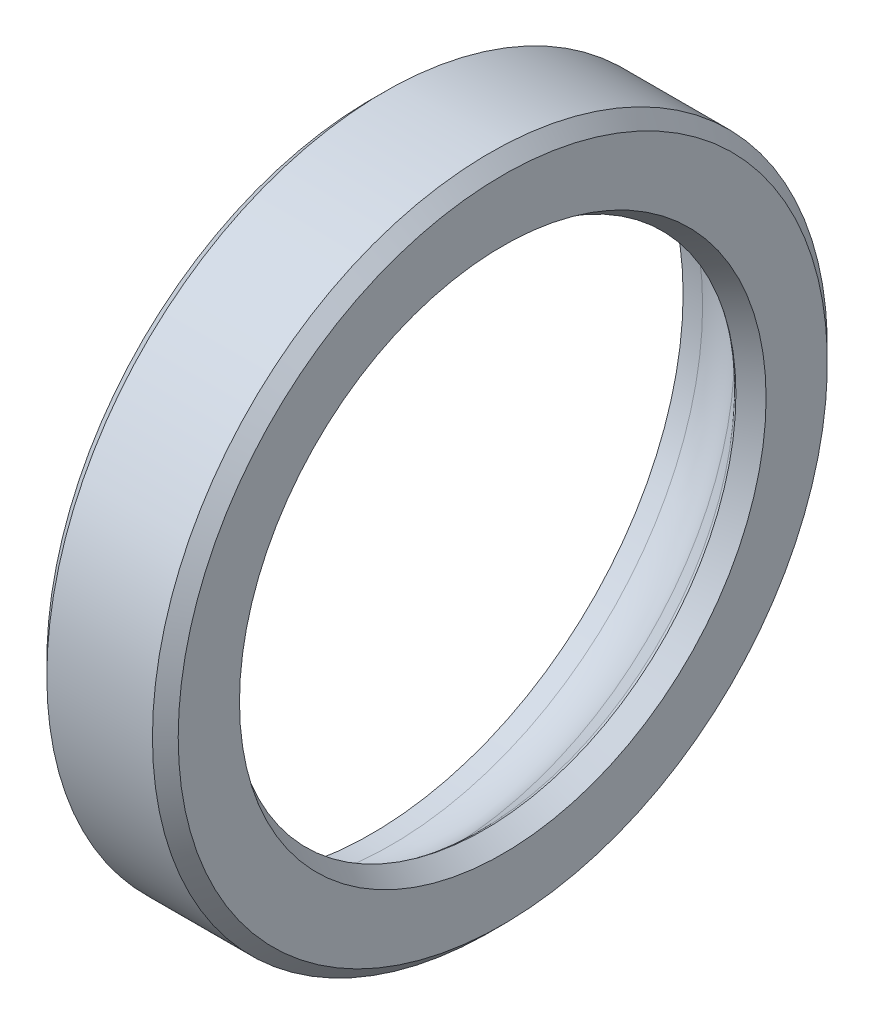
ISO-10303-21;
HEADER;
FILE_DESCRIPTION(('STEP AP214'),'2;1');
FILE_NAME('part.step','',(''),(''),'','','');
FILE_SCHEMA(('AUTOMOTIVE_DESIGN { 1 0 10303 214 1 1 1 1 }'));
ENDSEC;
DATA;
#1=APPLICATION_CONTEXT('core data for automotive mechanical design processes');
#2=APPLICATION_PROTOCOL_DEFINITION('international standard','automotive_design',2000,#1);
#3=PRODUCT_CONTEXT('',#1,'mechanical');
#4=PRODUCT('Part','Part','',(#3));
#5=PRODUCT_RELATED_PRODUCT_CATEGORY('part','',(#4));
#6=PRODUCT_DEFINITION_FORMATION('','',#4);
#7=PRODUCT_DEFINITION_CONTEXT('part definition',#1,'design');
#8=PRODUCT_DEFINITION('design','',#6,#7);
#9=PRODUCT_DEFINITION_SHAPE('','',#8);
#10=(LENGTH_UNIT() NAMED_UNIT(*) SI_UNIT(.MILLI.,.METRE.));
#11=(NAMED_UNIT(*) PLANE_ANGLE_UNIT() SI_UNIT($,.RADIAN.));
#12=(NAMED_UNIT(*) SI_UNIT($,.STERADIAN.) SOLID_ANGLE_UNIT());
#13=UNCERTAINTY_MEASURE_WITH_UNIT(LENGTH_MEASURE(1.E-05),#10,'distance_accuracy_value','');
#14=(GEOMETRIC_REPRESENTATION_CONTEXT(3) GLOBAL_UNCERTAINTY_ASSIGNED_CONTEXT((#13)) GLOBAL_UNIT_ASSIGNED_CONTEXT((#10,
#11,#12)) REPRESENTATION_CONTEXT('',''));
#15=CARTESIAN_POINT('',(0.,0.,0.));
#16=DIRECTION('',(0.,0.,1.));
#17=DIRECTION('',(1.,0.,0.));
#18=AXIS2_PLACEMENT_3D('',#15,#16,#17);
#19=CARTESIAN_POINT('',(0.,0.,0.));
#20=DIRECTION('',(-1.,0.,0.));
#21=DIRECTION('',(0.,0.,1.));
#22=AXIS2_PLACEMENT_3D('',#19,#20,#21);
#23=CYLINDRICAL_SURFACE('',#22,6.05);
#24=CARTESIAN_POINT('',(0.37867965644035,0.,0.));
#25=DIRECTION('',(-1.,0.,0.));
#26=DIRECTION('',(0.,0.,1.));
#27=AXIS2_PLACEMENT_3D('',#24,#25,#26);
#28=CIRCLE('',#27,6.05);
#29=CARTESIAN_POINT('',(0.37867965644035,0.,6.05));
#30=VERTEX_POINT('',#29);
#31=EDGE_CURVE('E75',#30,#30,#28,.T.);
#32=ORIENTED_EDGE('',*,*,#31,.F.);
#33=EDGE_LOOP('',(#32));
#34=FACE_BOUND('',#33,.T.);
#35=CARTESIAN_POINT('',(0.,0.,0.));
#36=DIRECTION('',(-1.,0.,0.));
#37=DIRECTION('',(0.,0.,1.));
#38=AXIS2_PLACEMENT_3D('',#35,#36,#37);
#39=CIRCLE('',#38,6.05);
#40=CARTESIAN_POINT('',(0.,0.,6.05));
#41=VERTEX_POINT('',#40);
#42=EDGE_CURVE('E66',#41,#41,#39,.T.);
#43=ORIENTED_EDGE('',*,*,#42,.T.);
#44=EDGE_LOOP('',(#43));
#45=FACE_BOUND('',#44,.T.);
#46=ADVANCED_FACE('F39',(#34,#45),#23,.F.);
#47=CARTESIAN_POINT('',(0.,6.05,0.));
#48=DIRECTION('',(1.,0.,0.));
#49=DIRECTION('',(0.,0.,-1.));
#50=AXIS2_PLACEMENT_3D('',#47,#48,#49);
#51=PLANE('',#50);
#52=CARTESIAN_POINT('',(0.,0.,0.));
#53=DIRECTION('',(1.,0.,0.));
#54=DIRECTION('',(0.,0.,-1.));
#55=AXIS2_PLACEMENT_3D('',#52,#53,#54);
#56=CIRCLE('',#55,6.3);
#57=CARTESIAN_POINT('',(0.,0.,-6.3));
#58=VERTEX_POINT('',#57);
#59=EDGE_CURVE('E10',#58,#58,#56,.F.);
#60=ORIENTED_EDGE('',*,*,#59,.T.);
#61=EDGE_LOOP('',(#60));
#62=FACE_BOUND('',#61,.T.);
#63=ORIENTED_EDGE('',*,*,#42,.F.);
#64=EDGE_LOOP('',(#63));
#65=FACE_BOUND('',#64,.T.);
#66=ADVANCED_FACE('F83',(#62,#65),#51,.F.);
#67=CARTESIAN_POINT('',(0.,0.,0.));
#68=DIRECTION('',(-1.,0.,0.));
#69=DIRECTION('',(0.,0.,1.));
#70=AXIS2_PLACEMENT_3D('',#67,#68,#69);
#71=CYLINDRICAL_SURFACE('',#70,6.55);
#72=CARTESIAN_POINT('',(2.29999999999999,0.,0.));
#73=DIRECTION('',(-1.,0.,0.));
#74=DIRECTION('',(0.,0.,1.));
#75=AXIS2_PLACEMENT_3D('',#72,#73,#74);
#76=CIRCLE('',#75,6.55);
#77=CARTESIAN_POINT('',(2.29999999999999,0.,6.55));
#78=VERTEX_POINT('',#77);
#79=EDGE_CURVE('E47',#78,#78,#76,.T.);
#80=ORIENTED_EDGE('',*,*,#79,.T.);
#81=EDGE_LOOP('',(#80));
#82=FACE_BOUND('',#81,.T.);
#83=CARTESIAN_POINT('',(0.249999999999998,0.,0.));
#84=DIRECTION('',(1.,0.,0.));
#85=DIRECTION('',(0.,0.,-1.));
#86=AXIS2_PLACEMENT_3D('',#83,#84,#85);
#87=CIRCLE('',#86,6.55);
#88=CARTESIAN_POINT('',(0.249999999999998,0.,-6.55));
#89=VERTEX_POINT('',#88);
#90=EDGE_CURVE('E51',#89,#89,#87,.T.);
#91=ORIENTED_EDGE('',*,*,#90,.T.);
#92=EDGE_LOOP('',(#91));
#93=FACE_BOUND('',#92,.T.);
#94=ADVANCED_FACE('F88',(#82,#93),#71,.T.);
#95=CARTESIAN_POINT('',(2.54999999999999,6.55,0.));
#96=DIRECTION('',(-1.,0.,0.));
#97=DIRECTION('',(0.,0.,1.));
#98=AXIS2_PLACEMENT_3D('',#95,#96,#97);
#99=PLANE('',#98);
#100=CARTESIAN_POINT('',(2.54999999999999,0.,0.));
#101=DIRECTION('',(-1.,0.,0.));
#102=DIRECTION('',(0.,0.,1.));
#103=AXIS2_PLACEMENT_3D('',#100,#101,#102);
#104=CIRCLE('',#103,5.11068442382471);
#105=CARTESIAN_POINT('',(2.54999999999999,0.,5.11068442382471));
#106=VERTEX_POINT('',#105);
#107=EDGE_CURVE('E60',#106,#106,#104,.T.);
#108=ORIENTED_EDGE('',*,*,#107,.T.);
#109=EDGE_LOOP('',(#108));
#110=FACE_BOUND('',#109,.T.);
#111=CARTESIAN_POINT('',(2.54999999999999,0.,0.));
#112=DIRECTION('',(-1.,0.,0.));
#113=DIRECTION('',(0.,0.,1.));
#114=AXIS2_PLACEMENT_3D('',#111,#112,#113);
#115=CIRCLE('',#114,6.29999999999999);
#116=CARTESIAN_POINT('',(2.54999999999999,0.,6.29999999999999));
#117=VERTEX_POINT('',#116);
#118=EDGE_CURVE('E63',#117,#117,#115,.F.);
#119=ORIENTED_EDGE('',*,*,#118,.T.);
#120=EDGE_LOOP('',(#119));
#121=FACE_BOUND('',#120,.T.);
#122=ADVANCED_FACE('F94',(#110,#121),#99,.F.);
#123=CARTESIAN_POINT('',(2.34497474683058,0.,0.));
#124=DIRECTION('',(-1.,0.,0.));
#125=DIRECTION('',(0.,0.,1.));
#126=AXIS2_PLACEMENT_3D('',#123,#124,#125);
#127=TOROIDAL_SURFACE('',#126,5.2,0.35);
#128=CARTESIAN_POINT('',(2.18756313292352,0.,0.));
#129=DIRECTION('',(1.,0.,0.));
#130=DIRECTION('',(0.,0.,-1.));
#131=AXIS2_PLACEMENT_3D('',#128,#129,#130);
#132=CIRCLE('',#131,4.88739548338649);
#133=CARTESIAN_POINT('',(2.18756313292352,0.,-4.88739548338649));
#134=VERTEX_POINT('',#133);
#135=EDGE_CURVE('E55',#134,#134,#132,.T.);
#136=ORIENTED_EDGE('',*,*,#135,.T.);
#137=EDGE_LOOP('',(#136));
#138=FACE_BOUND('',#137,.T.);
#139=CARTESIAN_POINT('',(2.09748737341529,0.,0.));
#140=DIRECTION('',(-1.,0.,0.));
#141=DIRECTION('',(0.,0.,1.));
#142=AXIS2_PLACEMENT_3D('',#139,#140,#141);
#143=CIRCLE('',#142,4.95251262658471);
#144=CARTESIAN_POINT('',(2.09748737341529,0.,4.95251262658471));
#145=VERTEX_POINT('',#144);
#146=EDGE_CURVE('E69',#145,#145,#143,.T.);
#147=ORIENTED_EDGE('',*,*,#146,.T.);
#148=EDGE_LOOP('',(#147));
#149=FACE_BOUND('',#148,.T.);
#150=ADVANCED_FACE('F118',(#138,#149),#127,.T.);
#151=CARTESIAN_POINT('',(1.43933982822018,0.,0.));
#152=DIRECTION('',(-1.,0.,0.));
#153=DIRECTION('',(0.,0.,1.));
#154=AXIS2_PLACEMENT_3D('',#151,#152,#153);
#155=CONICAL_SURFACE('',#154,5.61066017177982,0.78539816339745);
#156=ORIENTED_EDGE('',*,*,#146,.F.);
#157=EDGE_LOOP('',(#156));
#158=FACE_BOUND('',#157,.T.);
#159=CARTESIAN_POINT('',(1.43933982822018,0.,0.));
#160=DIRECTION('',(-1.,0.,0.));
#161=DIRECTION('',(0.,0.,1.));
#162=AXIS2_PLACEMENT_3D('',#159,#160,#161);
#163=CIRCLE('',#162,5.61066017177982);
#164=CARTESIAN_POINT('',(1.43933982822018,0.,5.61066017177982));
#165=VERTEX_POINT('',#164);
#166=EDGE_CURVE('E72',#165,#165,#163,.T.);
#167=ORIENTED_EDGE('',*,*,#166,.T.);
#168=EDGE_LOOP('',(#167));
#169=FACE_BOUND('',#168,.T.);
#170=ADVANCED_FACE('F123',(#158,#169),#155,.F.);
#171=CARTESIAN_POINT('',(0.378679656440356,0.,0.));
#172=DIRECTION('',(-1.,0.,0.));
#173=DIRECTION('',(0.,0.,1.));
#174=AXIS2_PLACEMENT_3D('',#171,#172,#173);
#175=TOROIDAL_SURFACE('',#174,4.55,1.5);
#176=ORIENTED_EDGE('',*,*,#166,.F.);
#177=EDGE_LOOP('',(#176));
#178=FACE_BOUND('',#177,.T.);
#179=ORIENTED_EDGE('',*,*,#31,.T.);
#180=EDGE_LOOP('',(#179));
#181=FACE_BOUND('',#180,.T.);
#182=ADVANCED_FACE('F79',(#178,#181),#175,.F.);
#183=CARTESIAN_POINT('',(2.54999999999999,0.,0.));
#184=DIRECTION('',(1.,0.,0.));
#185=DIRECTION('',(0.,0.,-1.));
#186=AXIS2_PLACEMENT_3D('',#183,#184,#185);
#187=CONICAL_SURFACE('',#186,5.11068442382471,0.552156874407742);
#188=ORIENTED_EDGE('',*,*,#135,.F.);
#189=EDGE_LOOP('',(#188));
#190=FACE_BOUND('',#189,.T.);
#191=ORIENTED_EDGE('',*,*,#107,.F.);
#192=EDGE_LOOP('',(#191));
#193=FACE_BOUND('',#192,.T.);
#194=ADVANCED_FACE('F99',(#190,#193),#187,.F.);
#195=CARTESIAN_POINT('',(2.29999999999999,0.,0.));
#196=DIRECTION('',(-1.,0.,0.));
#197=DIRECTION('',(0.,0.,1.));
#198=AXIS2_PLACEMENT_3D('',#195,#196,#197);
#199=CONICAL_SURFACE('',#198,6.55,0.785398163397448);
#200=ORIENTED_EDGE('',*,*,#118,.F.);
#201=EDGE_LOOP('',(#200));
#202=FACE_BOUND('',#201,.T.);
#203=ORIENTED_EDGE('',*,*,#79,.F.);
#204=EDGE_LOOP('',(#203));
#205=FACE_BOUND('',#204,.T.);
#206=ADVANCED_FACE('F104',(#202,#205),#199,.T.);
#207=CARTESIAN_POINT('',(0.,0.,0.));
#208=DIRECTION('',(1.,0.,0.));
#209=DIRECTION('',(0.,0.,-1.));
#210=AXIS2_PLACEMENT_3D('',#207,#208,#209);
#211=CONICAL_SURFACE('',#210,6.3,0.785398163397448);
#212=ORIENTED_EDGE('',*,*,#90,.F.);
#213=EDGE_LOOP('',(#212));
#214=FACE_BOUND('',#213,.T.);
#215=ORIENTED_EDGE('',*,*,#59,.F.);
#216=EDGE_LOOP('',(#215));
#217=FACE_BOUND('',#216,.T.);
#218=ADVANCED_FACE('F42',(#214,#217),#211,.T.);
#219=CLOSED_SHELL('',(#46,#66,#94,#122,#150,#170,#182,#194,#206,#218));
#220=MANIFOLD_SOLID_BREP('B2',#219);
#221=ADVANCED_BREP_SHAPE_REPRESENTATION('',(#18,#220),#14);
#222=SHAPE_DEFINITION_REPRESENTATION(#9,#221);
ENDSEC;
END-ISO-10303-21;
